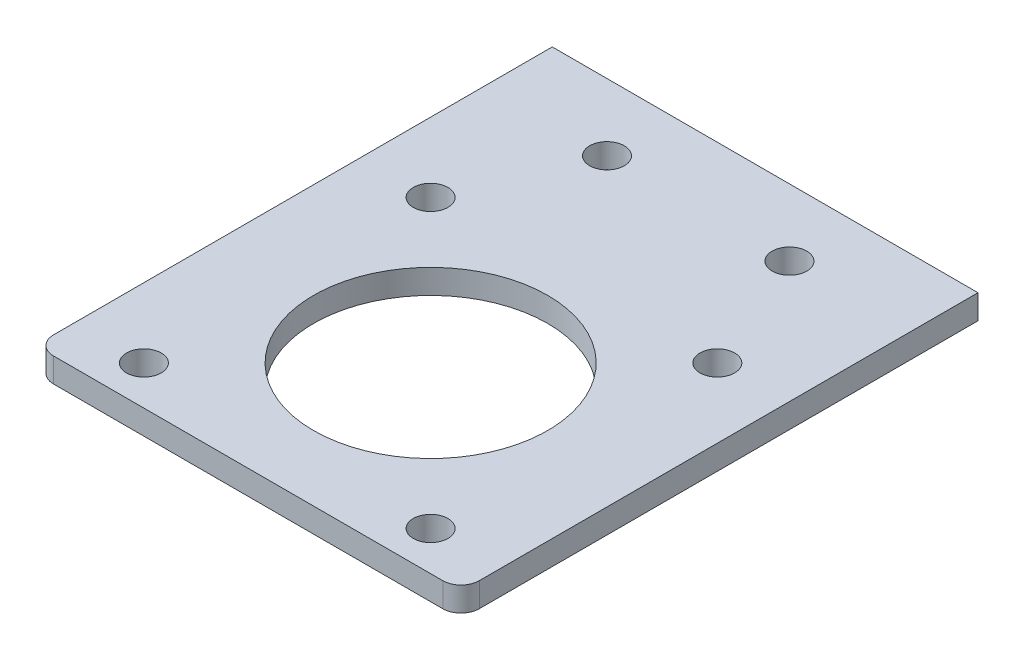
ISO-10303-21;
HEADER;
FILE_DESCRIPTION(('STEP AP214'),'2;1');
FILE_NAME('part.step','',(''),(''),'','','');
FILE_SCHEMA(('AUTOMOTIVE_DESIGN { 1 0 10303 214 1 1 1 1 }'));
ENDSEC;
DATA;
#1=APPLICATION_CONTEXT('core data for automotive mechanical design processes');
#2=APPLICATION_PROTOCOL_DEFINITION('international standard','automotive_design',2000,#1);
#3=PRODUCT_CONTEXT('',#1,'mechanical');
#4=PRODUCT('Part','Part','',(#3));
#5=PRODUCT_RELATED_PRODUCT_CATEGORY('part','',(#4));
#6=PRODUCT_DEFINITION_FORMATION('','',#4);
#7=PRODUCT_DEFINITION_CONTEXT('part definition',#1,'design');
#8=PRODUCT_DEFINITION('design','',#6,#7);
#9=PRODUCT_DEFINITION_SHAPE('','',#8);
#10=(LENGTH_UNIT() NAMED_UNIT(*) SI_UNIT(.MILLI.,.METRE.));
#11=(NAMED_UNIT(*) PLANE_ANGLE_UNIT() SI_UNIT($,.RADIAN.));
#12=(NAMED_UNIT(*) SI_UNIT($,.STERADIAN.) SOLID_ANGLE_UNIT());
#13=UNCERTAINTY_MEASURE_WITH_UNIT(LENGTH_MEASURE(1.E-05),#10,'distance_accuracy_value','');
#14=(GEOMETRIC_REPRESENTATION_CONTEXT(3) GLOBAL_UNCERTAINTY_ASSIGNED_CONTEXT((#13)) GLOBAL_UNIT_ASSIGNED_CONTEXT((#10,
#11,#12)) REPRESENTATION_CONTEXT('',''));
#15=CARTESIAN_POINT('',(0.,0.,0.));
#16=DIRECTION('',(0.,0.,1.));
#17=DIRECTION('',(1.,0.,0.));
#18=AXIS2_PLACEMENT_3D('',#15,#16,#17);
#19=CARTESIAN_POINT('',(-35.,4.,42.5));
#20=DIRECTION('',(1.,0.,0.));
#21=DIRECTION('',(0.,0.,-1.));
#22=AXIS2_PLACEMENT_3D('',#19,#20,#21);
#23=PLANE('',#22);
#24=DIRECTION('',(0.,0.,1.));
#25=VECTOR('',#24,1.);
#26=CARTESIAN_POINT('',(-35.,0.,42.5));
#27=LINE('',#26,#25);
#28=CARTESIAN_POINT('',(-35.,0.,-42.5));
#29=VERTEX_POINT('',#28);
#30=CARTESIAN_POINT('',(-35.,0.,39.5));
#31=VERTEX_POINT('',#30);
#32=EDGE_CURVE('E117',#29,#31,#27,.T.);
#33=ORIENTED_EDGE('',*,*,#32,.T.);
#34=DIRECTION('',(0.,-1.,0.));
#35=VECTOR('',#34,1.);
#36=CARTESIAN_POINT('',(-35.,4.,39.5));
#37=LINE('',#36,#35);
#38=CARTESIAN_POINT('',(-35.,4.,39.5));
#39=VERTEX_POINT('',#38);
#40=EDGE_CURVE('E11',#31,#39,#37,.F.);
#41=ORIENTED_EDGE('',*,*,#40,.T.);
#42=DIRECTION('',(0.,0.,1.));
#43=VECTOR('',#42,1.);
#44=CARTESIAN_POINT('',(-35.,4.,42.5));
#45=LINE('',#44,#43);
#46=CARTESIAN_POINT('',(-35.,4.,-42.5));
#47=VERTEX_POINT('',#46);
#48=EDGE_CURVE('E124',#47,#39,#45,.T.);
#49=ORIENTED_EDGE('',*,*,#48,.F.);
#50=DIRECTION('',(0.,-1.,0.));
#51=VECTOR('',#50,1.);
#52=CARTESIAN_POINT('',(-35.,4.,-42.5));
#53=LINE('',#52,#51);
#54=EDGE_CURVE('E109',#47,#29,#53,.T.);
#55=ORIENTED_EDGE('',*,*,#54,.T.);
#56=EDGE_LOOP('',(#33,#41,#49,#55));
#57=FACE_BOUND('',#56,.T.);
#58=ADVANCED_FACE('F35',(#57),#23,.F.);
#59=CARTESIAN_POINT('',(35.,4.,42.5));
#60=DIRECTION('',(0.,0.,-1.));
#61=DIRECTION('',(-1.,0.,0.));
#62=AXIS2_PLACEMENT_3D('',#59,#60,#61);
#63=PLANE('',#62);
#64=DIRECTION('',(1.,0.,0.));
#65=VECTOR('',#64,1.);
#66=CARTESIAN_POINT('',(35.,0.,42.5));
#67=LINE('',#66,#65);
#68=CARTESIAN_POINT('',(-32.,0.,42.5));
#69=VERTEX_POINT('',#68);
#70=CARTESIAN_POINT('',(32.,0.,42.5));
#71=VERTEX_POINT('',#70);
#72=EDGE_CURVE('E119',#69,#71,#67,.T.);
#73=ORIENTED_EDGE('',*,*,#72,.T.);
#74=DIRECTION('',(0.,-1.,0.));
#75=VECTOR('',#74,1.);
#76=CARTESIAN_POINT('',(32.,4.,42.5));
#77=LINE('',#76,#75);
#78=CARTESIAN_POINT('',(32.,4.,42.5));
#79=VERTEX_POINT('',#78);
#80=EDGE_CURVE('E56',#71,#79,#77,.F.);
#81=ORIENTED_EDGE('',*,*,#80,.T.);
#82=DIRECTION('',(1.,0.,0.));
#83=VECTOR('',#82,1.);
#84=CARTESIAN_POINT('',(35.,4.,42.5));
#85=LINE('',#84,#83);
#86=CARTESIAN_POINT('',(-32.,4.,42.5));
#87=VERTEX_POINT('',#86);
#88=EDGE_CURVE('E99',#87,#79,#85,.T.);
#89=ORIENTED_EDGE('',*,*,#88,.F.);
#90=DIRECTION('',(0.,-1.,0.));
#91=VECTOR('',#90,1.);
#92=CARTESIAN_POINT('',(-32.,4.,42.5));
#93=LINE('',#92,#91);
#94=EDGE_CURVE('E131',#87,#69,#93,.T.);
#95=ORIENTED_EDGE('',*,*,#94,.T.);
#96=EDGE_LOOP('',(#73,#81,#89,#95));
#97=FACE_BOUND('',#96,.T.);
#98=ADVANCED_FACE('F139',(#97),#63,.F.);
#99=CARTESIAN_POINT('',(35.,4.,42.5));
#100=DIRECTION('',(-1.,0.,0.));
#101=DIRECTION('',(0.,0.,1.));
#102=AXIS2_PLACEMENT_3D('',#99,#100,#101);
#103=PLANE('',#102);
#104=DIRECTION('',(0.,0.,-1.));
#105=VECTOR('',#104,1.);
#106=CARTESIAN_POINT('',(35.,4.,42.5));
#107=LINE('',#106,#105);
#108=CARTESIAN_POINT('',(35.,4.,39.5));
#109=VERTEX_POINT('',#108);
#110=CARTESIAN_POINT('',(35.,4.,-42.5));
#111=VERTEX_POINT('',#110);
#112=EDGE_CURVE('E89',#109,#111,#107,.T.);
#113=ORIENTED_EDGE('',*,*,#112,.F.);
#114=DIRECTION('',(0.,-1.,0.));
#115=VECTOR('',#114,1.);
#116=CARTESIAN_POINT('',(35.,4.,39.5));
#117=LINE('',#116,#115);
#118=CARTESIAN_POINT('',(35.,0.,39.5));
#119=VERTEX_POINT('',#118);
#120=EDGE_CURVE('E108',#109,#119,#117,.T.);
#121=ORIENTED_EDGE('',*,*,#120,.T.);
#122=DIRECTION('',(0.,0.,-1.));
#123=VECTOR('',#122,1.);
#124=CARTESIAN_POINT('',(35.,0.,42.5));
#125=LINE('',#124,#123);
#126=CARTESIAN_POINT('',(35.,0.,-42.5));
#127=VERTEX_POINT('',#126);
#128=EDGE_CURVE('E105',#119,#127,#125,.T.);
#129=ORIENTED_EDGE('',*,*,#128,.T.);
#130=DIRECTION('',(0.,-1.,0.));
#131=VECTOR('',#130,1.);
#132=CARTESIAN_POINT('',(35.,4.,-42.5));
#133=LINE('',#132,#131);
#134=EDGE_CURVE('E102',#111,#127,#133,.T.);
#135=ORIENTED_EDGE('',*,*,#134,.F.);
#136=EDGE_LOOP('',(#113,#121,#129,#135));
#137=FACE_BOUND('',#136,.T.);
#138=ADVANCED_FACE('F103',(#137),#103,.F.);
#139=CARTESIAN_POINT('',(35.,4.,-42.5));
#140=DIRECTION('',(0.,0.,1.));
#141=DIRECTION('',(1.,0.,0.));
#142=AXIS2_PLACEMENT_3D('',#139,#140,#141);
#143=PLANE('',#142);
#144=DIRECTION('',(-1.,0.,0.));
#145=VECTOR('',#144,1.);
#146=CARTESIAN_POINT('',(35.,0.,-42.5));
#147=LINE('',#146,#145);
#148=EDGE_CURVE('E123',#127,#29,#147,.T.);
#149=ORIENTED_EDGE('',*,*,#148,.T.);
#150=ORIENTED_EDGE('',*,*,#54,.F.);
#151=DIRECTION('',(-1.,0.,0.));
#152=VECTOR('',#151,1.);
#153=CARTESIAN_POINT('',(35.,4.,-42.5));
#154=LINE('',#153,#152);
#155=EDGE_CURVE('E93',#111,#47,#154,.T.);
#156=ORIENTED_EDGE('',*,*,#155,.F.);
#157=ORIENTED_EDGE('',*,*,#134,.T.);
#158=EDGE_LOOP('',(#149,#150,#156,#157));
#159=FACE_BOUND('',#158,.T.);
#160=ADVANCED_FACE('F111',(#159),#143,.F.);
#161=CARTESIAN_POINT('',(0.,4.,0.));
#162=DIRECTION('',(0.,1.,0.));
#163=DIRECTION('',(0.,0.,1.));
#164=AXIS2_PLACEMENT_3D('',#161,#162,#163);
#165=PLANE('',#164);
#166=CARTESIAN_POINT('',(-15.,4.,-31.5));
#167=DIRECTION('',(0.,1.,0.));
#168=DIRECTION('',(0.,0.,1.));
#169=AXIS2_PLACEMENT_3D('',#166,#167,#168);
#170=CIRCLE('',#169,2.85);
#171=CARTESIAN_POINT('',(-15.,4.,-28.65));
#172=VERTEX_POINT('',#171);
#173=EDGE_CURVE('E182',#172,#172,#170,.T.);
#174=ORIENTED_EDGE('',*,*,#173,.F.);
#175=EDGE_LOOP('',(#174));
#176=FACE_BOUND('',#175,.T.);
#177=CARTESIAN_POINT('',(15.,4.,-31.5));
#178=DIRECTION('',(0.,1.,0.));
#179=DIRECTION('',(0.,0.,1.));
#180=AXIS2_PLACEMENT_3D('',#177,#178,#179);
#181=CIRCLE('',#180,2.85);
#182=CARTESIAN_POINT('',(15.,4.,-28.65));
#183=VERTEX_POINT('',#182);
#184=EDGE_CURVE('E176',#183,#183,#181,.T.);
#185=ORIENTED_EDGE('',*,*,#184,.F.);
#186=EDGE_LOOP('',(#185));
#187=FACE_BOUND('',#186,.T.);
#188=CARTESIAN_POINT('',(0.,4.,12.5));
#189=DIRECTION('',(0.,1.,0.));
#190=DIRECTION('',(0.,0.,1.));
#191=AXIS2_PLACEMENT_3D('',#188,#189,#190);
#192=CIRCLE('',#191,19.25);
#193=CARTESIAN_POINT('',(0.,4.,31.75));
#194=VERTEX_POINT('',#193);
#195=EDGE_CURVE('E170',#194,#194,#192,.T.);
#196=ORIENTED_EDGE('',*,*,#195,.F.);
#197=EDGE_LOOP('',(#196));
#198=FACE_BOUND('',#197,.T.);
#199=CARTESIAN_POINT('',(23.57,4.,-11.07));
#200=DIRECTION('',(0.,1.,0.));
#201=DIRECTION('',(0.,0.,1.));
#202=AXIS2_PLACEMENT_3D('',#199,#200,#201);
#203=CIRCLE('',#202,2.85000000000001);
#204=CARTESIAN_POINT('',(23.57,4.,-8.21999999999999));
#205=VERTEX_POINT('',#204);
#206=EDGE_CURVE('E164',#205,#205,#203,.T.);
#207=ORIENTED_EDGE('',*,*,#206,.F.);
#208=EDGE_LOOP('',(#207));
#209=FACE_BOUND('',#208,.T.);
#210=CARTESIAN_POINT('',(23.57,4.,36.07));
#211=DIRECTION('',(0.,1.,0.));
#212=DIRECTION('',(0.,0.,1.));
#213=AXIS2_PLACEMENT_3D('',#210,#211,#212);
#214=CIRCLE('',#213,2.85000000000002);
#215=CARTESIAN_POINT('',(23.57,4.,38.92));
#216=VERTEX_POINT('',#215);
#217=EDGE_CURVE('E158',#216,#216,#214,.T.);
#218=ORIENTED_EDGE('',*,*,#217,.F.);
#219=EDGE_LOOP('',(#218));
#220=FACE_BOUND('',#219,.T.);
#221=CARTESIAN_POINT('',(-23.57,4.,36.07));
#222=DIRECTION('',(0.,1.,0.));
#223=DIRECTION('',(0.,0.,1.));
#224=AXIS2_PLACEMENT_3D('',#221,#222,#223);
#225=CIRCLE('',#224,2.85000000000002);
#226=CARTESIAN_POINT('',(-23.57,4.,38.92));
#227=VERTEX_POINT('',#226);
#228=EDGE_CURVE('E152',#227,#227,#225,.T.);
#229=ORIENTED_EDGE('',*,*,#228,.F.);
#230=EDGE_LOOP('',(#229));
#231=FACE_BOUND('',#230,.T.);
#232=CARTESIAN_POINT('',(-23.57,4.,-11.07));
#233=DIRECTION('',(0.,1.,0.));
#234=DIRECTION('',(0.,0.,1.));
#235=AXIS2_PLACEMENT_3D('',#232,#233,#234);
#236=CIRCLE('',#235,2.85000000000001);
#237=CARTESIAN_POINT('',(-23.57,4.,-8.21999999999998));
#238=VERTEX_POINT('',#237);
#239=EDGE_CURVE('E146',#238,#238,#236,.T.);
#240=ORIENTED_EDGE('',*,*,#239,.F.);
#241=EDGE_LOOP('',(#240));
#242=FACE_BOUND('',#241,.T.);
#243=ORIENTED_EDGE('',*,*,#88,.T.);
#244=CARTESIAN_POINT('',(32.,4.,39.5));
#245=DIRECTION('',(0.,1.,0.));
#246=DIRECTION('',(0.,0.,1.));
#247=AXIS2_PLACEMENT_3D('',#244,#245,#246);
#248=CIRCLE('',#247,3.);
#249=EDGE_CURVE('E43',#79,#109,#248,.T.);
#250=ORIENTED_EDGE('',*,*,#249,.T.);
#251=ORIENTED_EDGE('',*,*,#112,.T.);
#252=ORIENTED_EDGE('',*,*,#155,.T.);
#253=ORIENTED_EDGE('',*,*,#48,.T.);
#254=CARTESIAN_POINT('',(-32.,4.,39.5));
#255=DIRECTION('',(0.,1.,0.));
#256=DIRECTION('',(0.,0.,1.));
#257=AXIS2_PLACEMENT_3D('',#254,#255,#256);
#258=CIRCLE('',#257,3.);
#259=EDGE_CURVE('E135',#39,#87,#258,.T.);
#260=ORIENTED_EDGE('',*,*,#259,.T.);
#261=EDGE_LOOP('',(#243,#250,#251,#252,#253,#260));
#262=FACE_BOUND('',#261,.T.);
#263=ADVANCED_FACE('F91',(#176,#187,#198,#209,#220,#231,#242,#262),#165,.T.);
#264=CARTESIAN_POINT('',(0.,0.,0.));
#265=DIRECTION('',(0.,1.,0.));
#266=DIRECTION('',(0.,0.,1.));
#267=AXIS2_PLACEMENT_3D('',#264,#265,#266);
#268=PLANE('',#267);
#269=CARTESIAN_POINT('',(-15.,0.,-31.5));
#270=DIRECTION('',(0.,1.,0.));
#271=DIRECTION('',(0.,0.,1.));
#272=AXIS2_PLACEMENT_3D('',#269,#270,#271);
#273=CIRCLE('',#272,2.85);
#274=CARTESIAN_POINT('',(-15.,0.,-28.65));
#275=VERTEX_POINT('',#274);
#276=EDGE_CURVE('E179',#275,#275,#273,.T.);
#277=ORIENTED_EDGE('',*,*,#276,.T.);
#278=EDGE_LOOP('',(#277));
#279=FACE_BOUND('',#278,.T.);
#280=CARTESIAN_POINT('',(15.,0.,-31.5));
#281=DIRECTION('',(0.,1.,0.));
#282=DIRECTION('',(0.,0.,1.));
#283=AXIS2_PLACEMENT_3D('',#280,#281,#282);
#284=CIRCLE('',#283,2.85);
#285=CARTESIAN_POINT('',(15.,0.,-28.65));
#286=VERTEX_POINT('',#285);
#287=EDGE_CURVE('E173',#286,#286,#284,.T.);
#288=ORIENTED_EDGE('',*,*,#287,.T.);
#289=EDGE_LOOP('',(#288));
#290=FACE_BOUND('',#289,.T.);
#291=CARTESIAN_POINT('',(0.,0.,12.5));
#292=DIRECTION('',(0.,1.,0.));
#293=DIRECTION('',(0.,0.,1.));
#294=AXIS2_PLACEMENT_3D('',#291,#292,#293);
#295=CIRCLE('',#294,19.25);
#296=CARTESIAN_POINT('',(0.,0.,31.75));
#297=VERTEX_POINT('',#296);
#298=EDGE_CURVE('E167',#297,#297,#295,.T.);
#299=ORIENTED_EDGE('',*,*,#298,.T.);
#300=EDGE_LOOP('',(#299));
#301=FACE_BOUND('',#300,.T.);
#302=CARTESIAN_POINT('',(23.57,0.,-11.07));
#303=DIRECTION('',(0.,1.,0.));
#304=DIRECTION('',(0.,0.,1.));
#305=AXIS2_PLACEMENT_3D('',#302,#303,#304);
#306=CIRCLE('',#305,2.85000000000001);
#307=CARTESIAN_POINT('',(23.57,0.,-8.21999999999999));
#308=VERTEX_POINT('',#307);
#309=EDGE_CURVE('E161',#308,#308,#306,.T.);
#310=ORIENTED_EDGE('',*,*,#309,.T.);
#311=EDGE_LOOP('',(#310));
#312=FACE_BOUND('',#311,.T.);
#313=CARTESIAN_POINT('',(23.57,0.,36.07));
#314=DIRECTION('',(0.,1.,0.));
#315=DIRECTION('',(0.,0.,1.));
#316=AXIS2_PLACEMENT_3D('',#313,#314,#315);
#317=CIRCLE('',#316,2.85000000000002);
#318=CARTESIAN_POINT('',(23.57,0.,38.92));
#319=VERTEX_POINT('',#318);
#320=EDGE_CURVE('E155',#319,#319,#317,.T.);
#321=ORIENTED_EDGE('',*,*,#320,.T.);
#322=EDGE_LOOP('',(#321));
#323=FACE_BOUND('',#322,.T.);
#324=CARTESIAN_POINT('',(-23.57,0.,36.07));
#325=DIRECTION('',(0.,1.,0.));
#326=DIRECTION('',(0.,0.,1.));
#327=AXIS2_PLACEMENT_3D('',#324,#325,#326);
#328=CIRCLE('',#327,2.85000000000002);
#329=CARTESIAN_POINT('',(-23.57,0.,38.92));
#330=VERTEX_POINT('',#329);
#331=EDGE_CURVE('E149',#330,#330,#328,.T.);
#332=ORIENTED_EDGE('',*,*,#331,.T.);
#333=EDGE_LOOP('',(#332));
#334=FACE_BOUND('',#333,.T.);
#335=CARTESIAN_POINT('',(-23.57,0.,-11.07));
#336=DIRECTION('',(0.,1.,0.));
#337=DIRECTION('',(0.,0.,1.));
#338=AXIS2_PLACEMENT_3D('',#335,#336,#337);
#339=CIRCLE('',#338,2.85000000000001);
#340=CARTESIAN_POINT('',(-23.57,0.,-8.21999999999998));
#341=VERTEX_POINT('',#340);
#342=EDGE_CURVE('E120',#341,#341,#339,.T.);
#343=ORIENTED_EDGE('',*,*,#342,.T.);
#344=EDGE_LOOP('',(#343));
#345=FACE_BOUND('',#344,.T.);
#346=ORIENTED_EDGE('',*,*,#128,.F.);
#347=CARTESIAN_POINT('',(32.,0.,39.5));
#348=DIRECTION('',(0.,1.,0.));
#349=DIRECTION('',(0.,0.,1.));
#350=AXIS2_PLACEMENT_3D('',#347,#348,#349);
#351=CIRCLE('',#350,3.);
#352=EDGE_CURVE('E129',#119,#71,#351,.F.);
#353=ORIENTED_EDGE('',*,*,#352,.T.);
#354=ORIENTED_EDGE('',*,*,#72,.F.);
#355=CARTESIAN_POINT('',(-32.,0.,39.5));
#356=DIRECTION('',(0.,1.,0.));
#357=DIRECTION('',(0.,0.,1.));
#358=AXIS2_PLACEMENT_3D('',#355,#356,#357);
#359=CIRCLE('',#358,3.);
#360=EDGE_CURVE('E127',#69,#31,#359,.F.);
#361=ORIENTED_EDGE('',*,*,#360,.T.);
#362=ORIENTED_EDGE('',*,*,#32,.F.);
#363=ORIENTED_EDGE('',*,*,#148,.F.);
#364=EDGE_LOOP('',(#346,#353,#354,#361,#362,#363));
#365=FACE_BOUND('',#364,.T.);
#366=ADVANCED_FACE('F143',(#279,#290,#301,#312,#323,#334,#345,#365),#268,.F.);
#367=CARTESIAN_POINT('',(-23.57,0.,-11.07));
#368=DIRECTION('',(0.,1.,0.));
#369=DIRECTION('',(0.,0.,1.));
#370=AXIS2_PLACEMENT_3D('',#367,#368,#369);
#371=CYLINDRICAL_SURFACE('',#370,2.85000000000001);
#372=ORIENTED_EDGE('',*,*,#342,.F.);
#373=EDGE_LOOP('',(#372));
#374=FACE_BOUND('',#373,.T.);
#375=ORIENTED_EDGE('',*,*,#239,.T.);
#376=EDGE_LOOP('',(#375));
#377=FACE_BOUND('',#376,.T.);
#378=ADVANCED_FACE('F213',(#374,#377),#371,.F.);
#379=CARTESIAN_POINT('',(-23.57,0.,36.07));
#380=DIRECTION('',(0.,1.,0.));
#381=DIRECTION('',(0.,0.,1.));
#382=AXIS2_PLACEMENT_3D('',#379,#380,#381);
#383=CYLINDRICAL_SURFACE('',#382,2.85000000000002);
#384=ORIENTED_EDGE('',*,*,#331,.F.);
#385=EDGE_LOOP('',(#384));
#386=FACE_BOUND('',#385,.T.);
#387=ORIENTED_EDGE('',*,*,#228,.T.);
#388=EDGE_LOOP('',(#387));
#389=FACE_BOUND('',#388,.T.);
#390=ADVANCED_FACE('F215',(#386,#389),#383,.F.);
#391=CARTESIAN_POINT('',(23.57,0.,36.07));
#392=DIRECTION('',(0.,1.,0.));
#393=DIRECTION('',(0.,0.,1.));
#394=AXIS2_PLACEMENT_3D('',#391,#392,#393);
#395=CYLINDRICAL_SURFACE('',#394,2.85000000000002);
#396=ORIENTED_EDGE('',*,*,#320,.F.);
#397=EDGE_LOOP('',(#396));
#398=FACE_BOUND('',#397,.T.);
#399=ORIENTED_EDGE('',*,*,#217,.T.);
#400=EDGE_LOOP('',(#399));
#401=FACE_BOUND('',#400,.T.);
#402=ADVANCED_FACE('F222',(#398,#401),#395,.F.);
#403=CARTESIAN_POINT('',(23.57,0.,-11.07));
#404=DIRECTION('',(0.,1.,0.));
#405=DIRECTION('',(0.,0.,1.));
#406=AXIS2_PLACEMENT_3D('',#403,#404,#405);
#407=CYLINDRICAL_SURFACE('',#406,2.85000000000001);
#408=ORIENTED_EDGE('',*,*,#309,.F.);
#409=EDGE_LOOP('',(#408));
#410=FACE_BOUND('',#409,.T.);
#411=ORIENTED_EDGE('',*,*,#206,.T.);
#412=EDGE_LOOP('',(#411));
#413=FACE_BOUND('',#412,.T.);
#414=ADVANCED_FACE('F302',(#410,#413),#407,.F.);
#415=CARTESIAN_POINT('',(0.,0.,12.5));
#416=DIRECTION('',(0.,1.,0.));
#417=DIRECTION('',(0.,0.,1.));
#418=AXIS2_PLACEMENT_3D('',#415,#416,#417);
#419=CYLINDRICAL_SURFACE('',#418,19.25);
#420=ORIENTED_EDGE('',*,*,#298,.F.);
#421=EDGE_LOOP('',(#420));
#422=FACE_BOUND('',#421,.T.);
#423=ORIENTED_EDGE('',*,*,#195,.T.);
#424=EDGE_LOOP('',(#423));
#425=FACE_BOUND('',#424,.T.);
#426=ADVANCED_FACE('F292',(#422,#425),#419,.F.);
#427=CARTESIAN_POINT('',(15.,0.,-31.5));
#428=DIRECTION('',(0.,1.,0.));
#429=DIRECTION('',(0.,0.,1.));
#430=AXIS2_PLACEMENT_3D('',#427,#428,#429);
#431=CYLINDRICAL_SURFACE('',#430,2.85);
#432=ORIENTED_EDGE('',*,*,#287,.F.);
#433=EDGE_LOOP('',(#432));
#434=FACE_BOUND('',#433,.T.);
#435=ORIENTED_EDGE('',*,*,#184,.T.);
#436=EDGE_LOOP('',(#435));
#437=FACE_BOUND('',#436,.T.);
#438=ADVANCED_FACE('F194',(#434,#437),#431,.F.);
#439=CARTESIAN_POINT('',(-15.,0.,-31.5));
#440=DIRECTION('',(0.,1.,0.));
#441=DIRECTION('',(0.,0.,1.));
#442=AXIS2_PLACEMENT_3D('',#439,#440,#441);
#443=CYLINDRICAL_SURFACE('',#442,2.85);
#444=ORIENTED_EDGE('',*,*,#276,.F.);
#445=EDGE_LOOP('',(#444));
#446=FACE_BOUND('',#445,.T.);
#447=ORIENTED_EDGE('',*,*,#173,.T.);
#448=EDGE_LOOP('',(#447));
#449=FACE_BOUND('',#448,.T.);
#450=ADVANCED_FACE('F190',(#446,#449),#443,.F.);
#451=CARTESIAN_POINT('',(32.,4.,39.5));
#452=DIRECTION('',(0.,-1.,0.));
#453=DIRECTION('',(0.,0.,-1.));
#454=AXIS2_PLACEMENT_3D('',#451,#452,#453);
#455=CYLINDRICAL_SURFACE('',#454,3.);
#456=ORIENTED_EDGE('',*,*,#249,.F.);
#457=ORIENTED_EDGE('',*,*,#80,.F.);
#458=ORIENTED_EDGE('',*,*,#352,.F.);
#459=ORIENTED_EDGE('',*,*,#120,.F.);
#460=EDGE_LOOP('',(#456,#457,#458,#459));
#461=FACE_BOUND('',#460,.T.);
#462=ADVANCED_FACE('F193',(#461),#455,.T.);
#463=CARTESIAN_POINT('',(-32.,4.,39.5));
#464=DIRECTION('',(0.,-1.,0.));
#465=DIRECTION('',(0.,0.,-1.));
#466=AXIS2_PLACEMENT_3D('',#463,#464,#465);
#467=CYLINDRICAL_SURFACE('',#466,3.);
#468=ORIENTED_EDGE('',*,*,#259,.F.);
#469=ORIENTED_EDGE('',*,*,#40,.F.);
#470=ORIENTED_EDGE('',*,*,#360,.F.);
#471=ORIENTED_EDGE('',*,*,#94,.F.);
#472=EDGE_LOOP('',(#468,#469,#470,#471));
#473=FACE_BOUND('',#472,.T.);
#474=ADVANCED_FACE('F37',(#473),#467,.T.);
#475=CLOSED_SHELL('',(#58,#98,#138,#160,#263,#366,#378,#390,#402,#414,#426,#438,#450,#462,#474));
#476=MANIFOLD_SOLID_BREP('B2',#475);
#477=ADVANCED_BREP_SHAPE_REPRESENTATION('',(#18,#476),#14);
#478=SHAPE_DEFINITION_REPRESENTATION(#9,#477);
ENDSEC;
END-ISO-10303-21;
